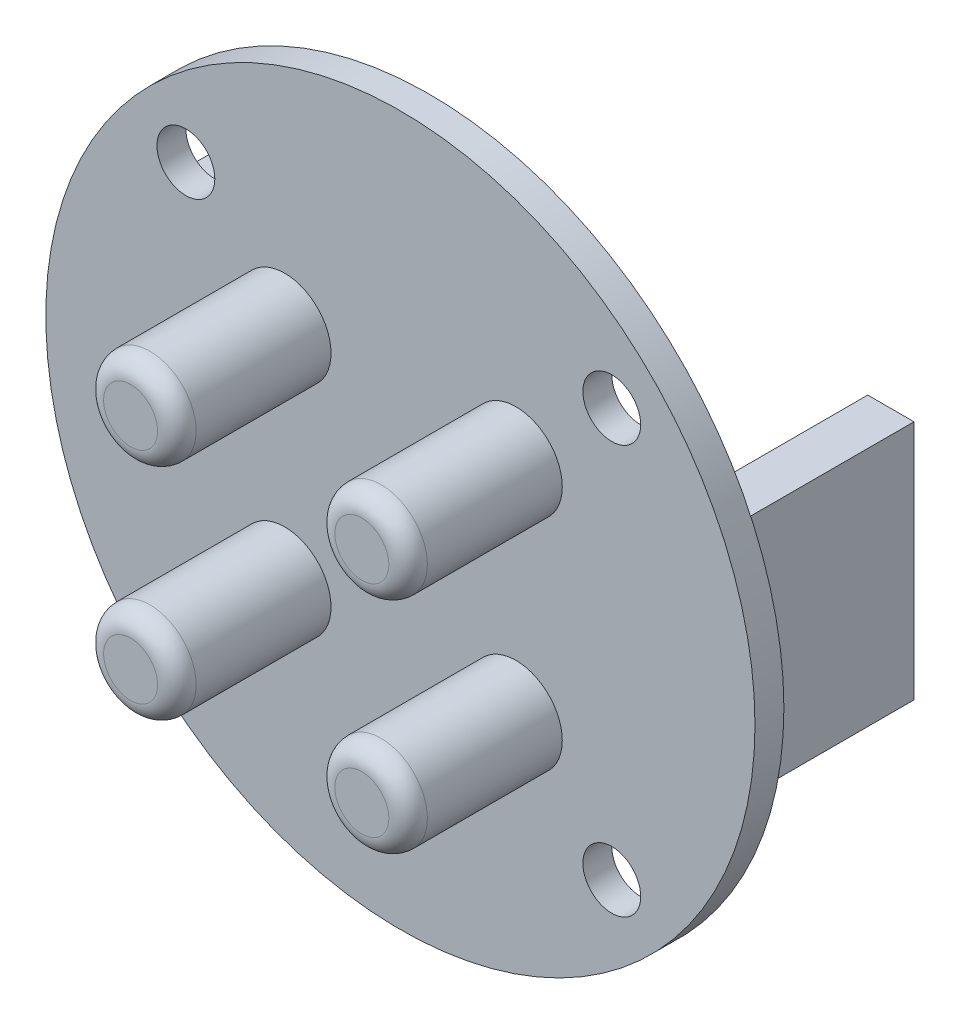
ISO-10303-21;
HEADER;
FILE_DESCRIPTION(('STEP AP214'),'2;1');
FILE_NAME('part.step','',(''),(''),'','','');
FILE_SCHEMA(('AUTOMOTIVE_DESIGN { 1 0 10303 214 1 1 1 1 }'));
ENDSEC;
DATA;
#1=APPLICATION_CONTEXT('core data for automotive mechanical design processes');
#2=APPLICATION_PROTOCOL_DEFINITION('international standard','automotive_design',2000,#1);
#3=PRODUCT_CONTEXT('',#1,'mechanical');
#4=PRODUCT('Part','Part','',(#3));
#5=PRODUCT_RELATED_PRODUCT_CATEGORY('part','',(#4));
#6=PRODUCT_DEFINITION_FORMATION('','',#4);
#7=PRODUCT_DEFINITION_CONTEXT('part definition',#1,'design');
#8=PRODUCT_DEFINITION('design','',#6,#7);
#9=PRODUCT_DEFINITION_SHAPE('','',#8);
#10=(LENGTH_UNIT() NAMED_UNIT(*) SI_UNIT(.MILLI.,.METRE.));
#11=(NAMED_UNIT(*) PLANE_ANGLE_UNIT() SI_UNIT($,.RADIAN.));
#12=(NAMED_UNIT(*) SI_UNIT($,.STERADIAN.) SOLID_ANGLE_UNIT());
#13=UNCERTAINTY_MEASURE_WITH_UNIT(LENGTH_MEASURE(1.E-05),#10,'distance_accuracy_value','');
#14=(GEOMETRIC_REPRESENTATION_CONTEXT(3) GLOBAL_UNCERTAINTY_ASSIGNED_CONTEXT((#13)) GLOBAL_UNIT_ASSIGNED_CONTEXT((#10,
#11,#12)) REPRESENTATION_CONTEXT('',''));
#15=CARTESIAN_POINT('',(0.,0.,0.));
#16=DIRECTION('',(0.,0.,1.));
#17=DIRECTION('',(1.,0.,0.));
#18=AXIS2_PLACEMENT_3D('',#15,#16,#17);
#19=CARTESIAN_POINT('',(0.,0.,0.));
#20=DIRECTION('',(0.,0.,1.));
#21=DIRECTION('',(1.,0.,0.));
#22=AXIS2_PLACEMENT_3D('',#19,#20,#21);
#23=PLANE('',#22);
#24=DIRECTION('',(0.,-1.,0.));
#25=VECTOR('',#24,1.);
#26=CARTESIAN_POINT('',(-12.75,6.25,0.));
#27=LINE('',#26,#25);
#28=CARTESIAN_POINT('',(-12.75,6.25,0.));
#29=VERTEX_POINT('',#28);
#30=CARTESIAN_POINT('',(-12.75,-6.25,0.));
#31=VERTEX_POINT('',#30);
#32=EDGE_CURVE('E119',#29,#31,#27,.T.);
#33=ORIENTED_EDGE('',*,*,#32,.F.);
#34=DIRECTION('',(1.,0.,0.));
#35=VECTOR('',#34,1.);
#36=CARTESIAN_POINT('',(-12.75,6.25,0.));
#37=LINE('',#36,#35);
#38=CARTESIAN_POINT('',(-15.15,6.25,0.));
#39=VERTEX_POINT('',#38);
#40=EDGE_CURVE('E132',#39,#29,#37,.T.);
#41=ORIENTED_EDGE('',*,*,#40,.F.);
#42=DIRECTION('',(0.,1.,0.));
#43=VECTOR('',#42,1.);
#44=CARTESIAN_POINT('',(-15.15,6.25,0.));
#45=LINE('',#44,#43);
#46=CARTESIAN_POINT('',(-15.15,-6.25,0.));
#47=VERTEX_POINT('',#46);
#48=EDGE_CURVE('E141',#47,#39,#45,.T.);
#49=ORIENTED_EDGE('',*,*,#48,.F.);
#50=DIRECTION('',(-1.,0.,0.));
#51=VECTOR('',#50,1.);
#52=CARTESIAN_POINT('',(-12.75,-6.25,0.));
#53=LINE('',#52,#51);
#54=EDGE_CURVE('E122',#31,#47,#53,.T.);
#55=ORIENTED_EDGE('',*,*,#54,.F.);
#56=EDGE_LOOP('',(#33,#41,#49,#55));
#57=FACE_BOUND('',#56,.T.);
#58=CARTESIAN_POINT('',(-11.1309461070474,10.5223503407509,0.));
#59=DIRECTION('',(0.,0.,-1.));
#60=DIRECTION('',(-1.,0.,0.));
#61=AXIS2_PLACEMENT_3D('',#58,#59,#60);
#62=CIRCLE('',#61,1.5);
#63=CARTESIAN_POINT('',(-12.6309461070474,10.5223503407509,0.));
#64=VERTEX_POINT('',#63);
#65=EDGE_CURVE('E161',#64,#64,#62,.T.);
#66=ORIENTED_EDGE('',*,*,#65,.F.);
#67=EDGE_LOOP('',(#66));
#68=FACE_BOUND('',#67,.T.);
#69=CARTESIAN_POINT('',(-11.1309461070474,-10.6776496592491,0.));
#70=DIRECTION('',(0.,0.,-1.));
#71=DIRECTION('',(-1.,0.,0.));
#72=AXIS2_PLACEMENT_3D('',#69,#70,#71);
#73=CIRCLE('',#72,1.5);
#74=CARTESIAN_POINT('',(-12.6309461070474,-10.6776496592491,0.));
#75=VERTEX_POINT('',#74);
#76=EDGE_CURVE('E158',#75,#75,#73,.T.);
#77=ORIENTED_EDGE('',*,*,#76,.F.);
#78=EDGE_LOOP('',(#77));
#79=FACE_BOUND('',#78,.T.);
#80=CARTESIAN_POINT('',(10.9690538929526,-10.6776496592491,0.));
#81=DIRECTION('',(0.,0.,-1.));
#82=DIRECTION('',(-1.,0.,0.));
#83=AXIS2_PLACEMENT_3D('',#80,#81,#82);
#84=CIRCLE('',#83,1.5);
#85=CARTESIAN_POINT('',(9.46905389295262,-10.6776496592491,0.));
#86=VERTEX_POINT('',#85);
#87=EDGE_CURVE('E162',#86,#86,#84,.T.);
#88=ORIENTED_EDGE('',*,*,#87,.F.);
#89=EDGE_LOOP('',(#88));
#90=FACE_BOUND('',#89,.T.);
#91=CARTESIAN_POINT('',(10.9690538929526,10.5223503407509,0.));
#92=DIRECTION('',(0.,0.,-1.));
#93=DIRECTION('',(-1.,0.,0.));
#94=AXIS2_PLACEMENT_3D('',#91,#92,#93);
#95=CIRCLE('',#94,1.5);
#96=CARTESIAN_POINT('',(9.46905389295262,10.5223503407509,0.));
#97=VERTEX_POINT('',#96);
#98=EDGE_CURVE('E157',#97,#97,#95,.T.);
#99=ORIENTED_EDGE('',*,*,#98,.F.);
#100=EDGE_LOOP('',(#99));
#101=FACE_BOUND('',#100,.T.);
#102=CARTESIAN_POINT('',(0.,0.,0.));
#103=DIRECTION('',(0.,0.,1.));
#104=DIRECTION('',(1.,0.,0.));
#105=AXIS2_PLACEMENT_3D('',#102,#103,#104);
#106=CIRCLE('',#105,18.4);
#107=CARTESIAN_POINT('',(18.4,0.,0.));
#108=VERTEX_POINT('',#107);
#109=EDGE_CURVE('E181',#108,#108,#106,.T.);
#110=ORIENTED_EDGE('',*,*,#109,.F.);
#111=EDGE_LOOP('',(#110));
#112=FACE_BOUND('',#111,.T.);
#113=DIRECTION('',(0.,-1.,0.));
#114=VECTOR('',#113,1.);
#115=CARTESIAN_POINT('',(15.15,6.25,0.));
#116=LINE('',#115,#114);
#117=CARTESIAN_POINT('',(15.15,6.25,0.));
#118=VERTEX_POINT('',#117);
#119=CARTESIAN_POINT('',(15.15,-6.25,0.));
#120=VERTEX_POINT('',#119);
#121=EDGE_CURVE('E118',#118,#120,#116,.T.);
#122=ORIENTED_EDGE('',*,*,#121,.F.);
#123=DIRECTION('',(1.,0.,0.));
#124=VECTOR('',#123,1.);
#125=CARTESIAN_POINT('',(15.15,6.25,0.));
#126=LINE('',#125,#124);
#127=CARTESIAN_POINT('',(12.75,6.25,0.));
#128=VERTEX_POINT('',#127);
#129=EDGE_CURVE('E115',#128,#118,#126,.T.);
#130=ORIENTED_EDGE('',*,*,#129,.F.);
#131=DIRECTION('',(0.,1.,0.));
#132=VECTOR('',#131,1.);
#133=CARTESIAN_POINT('',(12.75,6.25,0.));
#134=LINE('',#133,#132);
#135=CARTESIAN_POINT('',(12.75,-6.25,0.));
#136=VERTEX_POINT('',#135);
#137=EDGE_CURVE('E53',#136,#128,#134,.T.);
#138=ORIENTED_EDGE('',*,*,#137,.F.);
#139=DIRECTION('',(-1.,0.,0.));
#140=VECTOR('',#139,1.);
#141=CARTESIAN_POINT('',(15.15,-6.25,0.));
#142=LINE('',#141,#140);
#143=EDGE_CURVE('E48',#120,#136,#142,.T.);
#144=ORIENTED_EDGE('',*,*,#143,.F.);
#145=EDGE_LOOP('',(#122,#130,#138,#144));
#146=FACE_BOUND('',#145,.T.);
#147=ADVANCED_FACE('F33',(#57,#68,#79,#90,#101,#112,#146),#23,.F.);
#148=CARTESIAN_POINT('',(0.,0.,1.5));
#149=DIRECTION('',(0.,0.,-1.));
#150=DIRECTION('',(-1.,0.,0.));
#151=AXIS2_PLACEMENT_3D('',#148,#149,#150);
#152=CYLINDRICAL_SURFACE('',#151,18.4);
#153=CARTESIAN_POINT('',(0.,0.,1.5));
#154=DIRECTION('',(0.,0.,1.));
#155=DIRECTION('',(1.,0.,0.));
#156=AXIS2_PLACEMENT_3D('',#153,#154,#155);
#157=CIRCLE('',#156,18.4);
#158=CARTESIAN_POINT('',(18.4,0.,1.5));
#159=VERTEX_POINT('',#158);
#160=EDGE_CURVE('E182',#159,#159,#157,.T.);
#161=ORIENTED_EDGE('',*,*,#160,.F.);
#162=EDGE_LOOP('',(#161));
#163=FACE_BOUND('',#162,.T.);
#164=ORIENTED_EDGE('',*,*,#109,.T.);
#165=EDGE_LOOP('',(#164));
#166=FACE_BOUND('',#165,.T.);
#167=ADVANCED_FACE('F219',(#163,#166),#152,.T.);
#168=CARTESIAN_POINT('',(0.,0.,1.5));
#169=DIRECTION('',(0.,0.,1.));
#170=DIRECTION('',(1.,0.,0.));
#171=AXIS2_PLACEMENT_3D('',#168,#169,#170);
#172=PLANE('',#171);
#173=CARTESIAN_POINT('',(-6.,5.7,1.5));
#174=DIRECTION('',(0.,0.,1.));
#175=DIRECTION('',(1.,0.,0.));
#176=AXIS2_PLACEMENT_3D('',#173,#174,#175);
#177=CIRCLE('',#176,2.4);
#178=CARTESIAN_POINT('',(-3.6,5.7,1.5));
#179=VERTEX_POINT('',#178);
#180=EDGE_CURVE('E350',#179,#179,#177,.T.);
#181=ORIENTED_EDGE('',*,*,#180,.F.);
#182=EDGE_LOOP('',(#181));
#183=FACE_BOUND('',#182,.T.);
#184=CARTESIAN_POINT('',(-6.,-5.7,1.5));
#185=DIRECTION('',(0.,0.,1.));
#186=DIRECTION('',(1.,0.,0.));
#187=AXIS2_PLACEMENT_3D('',#184,#185,#186);
#188=CIRCLE('',#187,2.4);
#189=CARTESIAN_POINT('',(-3.6,-5.7,1.5));
#190=VERTEX_POINT('',#189);
#191=EDGE_CURVE('E347',#190,#190,#188,.T.);
#192=ORIENTED_EDGE('',*,*,#191,.F.);
#193=EDGE_LOOP('',(#192));
#194=FACE_BOUND('',#193,.T.);
#195=CARTESIAN_POINT('',(6.,-5.7,1.5));
#196=DIRECTION('',(0.,0.,1.));
#197=DIRECTION('',(1.,0.,0.));
#198=AXIS2_PLACEMENT_3D('',#195,#196,#197);
#199=CIRCLE('',#198,2.4);
#200=CARTESIAN_POINT('',(8.4,-5.7,1.5));
#201=VERTEX_POINT('',#200);
#202=EDGE_CURVE('E344',#201,#201,#199,.T.);
#203=ORIENTED_EDGE('',*,*,#202,.F.);
#204=EDGE_LOOP('',(#203));
#205=FACE_BOUND('',#204,.T.);
#206=CARTESIAN_POINT('',(6.,5.7,1.5));
#207=DIRECTION('',(0.,0.,1.));
#208=DIRECTION('',(1.,0.,0.));
#209=AXIS2_PLACEMENT_3D('',#206,#207,#208);
#210=CIRCLE('',#209,2.4);
#211=CARTESIAN_POINT('',(8.4,5.7,1.5));
#212=VERTEX_POINT('',#211);
#213=EDGE_CURVE('E330',#212,#212,#210,.T.);
#214=ORIENTED_EDGE('',*,*,#213,.F.);
#215=EDGE_LOOP('',(#214));
#216=FACE_BOUND('',#215,.T.);
#217=CARTESIAN_POINT('',(-11.1309461070474,10.5223503407509,1.5));
#218=DIRECTION('',(0.,0.,1.));
#219=DIRECTION('',(1.,0.,0.));
#220=AXIS2_PLACEMENT_3D('',#217,#218,#219);
#221=CIRCLE('',#220,1.5);
#222=CARTESIAN_POINT('',(-9.63094610704739,10.5223503407509,1.5));
#223=VERTEX_POINT('',#222);
#224=EDGE_CURVE('E178',#223,#223,#221,.T.);
#225=ORIENTED_EDGE('',*,*,#224,.F.);
#226=EDGE_LOOP('',(#225));
#227=FACE_BOUND('',#226,.T.);
#228=CARTESIAN_POINT('',(-11.1309461070474,-10.6776496592491,1.5));
#229=DIRECTION('',(0.,0.,1.));
#230=DIRECTION('',(1.,0.,0.));
#231=AXIS2_PLACEMENT_3D('',#228,#229,#230);
#232=CIRCLE('',#231,1.5);
#233=CARTESIAN_POINT('',(-9.63094610704739,-10.6776496592491,1.5));
#234=VERTEX_POINT('',#233);
#235=EDGE_CURVE('E175',#234,#234,#232,.T.);
#236=ORIENTED_EDGE('',*,*,#235,.F.);
#237=EDGE_LOOP('',(#236));
#238=FACE_BOUND('',#237,.T.);
#239=CARTESIAN_POINT('',(10.9690538929526,-10.6776496592491,1.5));
#240=DIRECTION('',(0.,0.,1.));
#241=DIRECTION('',(1.,0.,0.));
#242=AXIS2_PLACEMENT_3D('',#239,#240,#241);
#243=CIRCLE('',#242,1.5);
#244=CARTESIAN_POINT('',(12.4690538929526,-10.6776496592491,1.5));
#245=VERTEX_POINT('',#244);
#246=EDGE_CURVE('E172',#245,#245,#243,.T.);
#247=ORIENTED_EDGE('',*,*,#246,.F.);
#248=EDGE_LOOP('',(#247));
#249=FACE_BOUND('',#248,.T.);
#250=CARTESIAN_POINT('',(10.9690538929526,10.5223503407509,1.5));
#251=DIRECTION('',(0.,0.,1.));
#252=DIRECTION('',(1.,0.,0.));
#253=AXIS2_PLACEMENT_3D('',#250,#251,#252);
#254=CIRCLE('',#253,1.5);
#255=CARTESIAN_POINT('',(12.4690538929526,10.5223503407509,1.5));
#256=VERTEX_POINT('',#255);
#257=EDGE_CURVE('E169',#256,#256,#254,.T.);
#258=ORIENTED_EDGE('',*,*,#257,.F.);
#259=EDGE_LOOP('',(#258));
#260=FACE_BOUND('',#259,.T.);
#261=ORIENTED_EDGE('',*,*,#160,.T.);
#262=EDGE_LOOP('',(#261));
#263=FACE_BOUND('',#262,.T.);
#264=ADVANCED_FACE('F225',(#183,#194,#205,#216,#227,#238,#249,#260,#263),#172,.T.);
#265=CARTESIAN_POINT('',(10.9690538929526,10.5223503407509,10.));
#266=DIRECTION('',(0.,0.,-1.));
#267=DIRECTION('',(-1.,0.,0.));
#268=AXIS2_PLACEMENT_3D('',#265,#266,#267);
#269=CYLINDRICAL_SURFACE('',#268,1.5);
#270=ORIENTED_EDGE('',*,*,#257,.T.);
#271=EDGE_LOOP('',(#270));
#272=FACE_BOUND('',#271,.T.);
#273=ORIENTED_EDGE('',*,*,#98,.T.);
#274=EDGE_LOOP('',(#273));
#275=FACE_BOUND('',#274,.T.);
#276=ADVANCED_FACE('F310',(#272,#275),#269,.F.);
#277=CARTESIAN_POINT('',(10.9690538929526,-10.6776496592491,10.));
#278=DIRECTION('',(0.,0.,-1.));
#279=DIRECTION('',(-1.,0.,0.));
#280=AXIS2_PLACEMENT_3D('',#277,#278,#279);
#281=CYLINDRICAL_SURFACE('',#280,1.5);
#282=ORIENTED_EDGE('',*,*,#246,.T.);
#283=EDGE_LOOP('',(#282));
#284=FACE_BOUND('',#283,.T.);
#285=ORIENTED_EDGE('',*,*,#87,.T.);
#286=EDGE_LOOP('',(#285));
#287=FACE_BOUND('',#286,.T.);
#288=ADVANCED_FACE('F306',(#284,#287),#281,.F.);
#289=CARTESIAN_POINT('',(-11.1309461070474,-10.6776496592491,10.));
#290=DIRECTION('',(0.,0.,-1.));
#291=DIRECTION('',(-1.,0.,0.));
#292=AXIS2_PLACEMENT_3D('',#289,#290,#291);
#293=CYLINDRICAL_SURFACE('',#292,1.5);
#294=ORIENTED_EDGE('',*,*,#235,.T.);
#295=EDGE_LOOP('',(#294));
#296=FACE_BOUND('',#295,.T.);
#297=ORIENTED_EDGE('',*,*,#76,.T.);
#298=EDGE_LOOP('',(#297));
#299=FACE_BOUND('',#298,.T.);
#300=ADVANCED_FACE('F303',(#296,#299),#293,.F.);
#301=CARTESIAN_POINT('',(-11.1309461070474,10.5223503407509,10.));
#302=DIRECTION('',(0.,0.,-1.));
#303=DIRECTION('',(-1.,0.,0.));
#304=AXIS2_PLACEMENT_3D('',#301,#302,#303);
#305=CYLINDRICAL_SURFACE('',#304,1.5);
#306=ORIENTED_EDGE('',*,*,#224,.T.);
#307=EDGE_LOOP('',(#306));
#308=FACE_BOUND('',#307,.T.);
#309=ORIENTED_EDGE('',*,*,#65,.T.);
#310=EDGE_LOOP('',(#309));
#311=FACE_BOUND('',#310,.T.);
#312=ADVANCED_FACE('F301',(#308,#311),#305,.F.);
#313=CARTESIAN_POINT('',(-12.75,6.25,-10.));
#314=DIRECTION('',(-1.,0.,0.));
#315=DIRECTION('',(0.,0.,1.));
#316=AXIS2_PLACEMENT_3D('',#313,#314,#315);
#317=PLANE('',#316);
#318=ORIENTED_EDGE('',*,*,#32,.T.);
#319=DIRECTION('',(0.,0.,1.));
#320=VECTOR('',#319,1.);
#321=CARTESIAN_POINT('',(-12.75,-6.25,-10.));
#322=LINE('',#321,#320);
#323=CARTESIAN_POINT('',(-12.75,-6.25,-10.));
#324=VERTEX_POINT('',#323);
#325=EDGE_CURVE('E154',#324,#31,#322,.T.);
#326=ORIENTED_EDGE('',*,*,#325,.F.);
#327=DIRECTION('',(0.,-1.,0.));
#328=VECTOR('',#327,1.);
#329=CARTESIAN_POINT('',(-12.75,6.25,-10.));
#330=LINE('',#329,#328);
#331=CARTESIAN_POINT('',(-12.75,6.25,-10.));
#332=VERTEX_POINT('',#331);
#333=EDGE_CURVE('E128',#332,#324,#330,.T.);
#334=ORIENTED_EDGE('',*,*,#333,.F.);
#335=DIRECTION('',(0.,0.,1.));
#336=VECTOR('',#335,1.);
#337=CARTESIAN_POINT('',(-12.75,6.25,-10.));
#338=LINE('',#337,#336);
#339=EDGE_CURVE('E137',#332,#29,#338,.T.);
#340=ORIENTED_EDGE('',*,*,#339,.T.);
#341=EDGE_LOOP('',(#318,#326,#334,#340));
#342=FACE_BOUND('',#341,.T.);
#343=ADVANCED_FACE('F297',(#342),#317,.F.);
#344=CARTESIAN_POINT('',(-12.75,-6.25,-10.));
#345=DIRECTION('',(0.,1.,0.));
#346=DIRECTION('',(0.,0.,1.));
#347=AXIS2_PLACEMENT_3D('',#344,#345,#346);
#348=PLANE('',#347);
#349=ORIENTED_EDGE('',*,*,#54,.T.);
#350=DIRECTION('',(0.,0.,1.));
#351=VECTOR('',#350,1.);
#352=CARTESIAN_POINT('',(-15.15,-6.25,-10.));
#353=LINE('',#352,#351);
#354=CARTESIAN_POINT('',(-15.15,-6.25,-10.));
#355=VERTEX_POINT('',#354);
#356=EDGE_CURVE('E151',#355,#47,#353,.T.);
#357=ORIENTED_EDGE('',*,*,#356,.F.);
#358=DIRECTION('',(-1.,0.,0.));
#359=VECTOR('',#358,1.);
#360=CARTESIAN_POINT('',(-12.75,-6.25,-10.));
#361=LINE('',#360,#359);
#362=EDGE_CURVE('E131',#324,#355,#361,.T.);
#363=ORIENTED_EDGE('',*,*,#362,.F.);
#364=ORIENTED_EDGE('',*,*,#325,.T.);
#365=EDGE_LOOP('',(#349,#357,#363,#364));
#366=FACE_BOUND('',#365,.T.);
#367=ADVANCED_FACE('F293',(#366),#348,.F.);
#368=CARTESIAN_POINT('',(-15.15,6.25,-10.));
#369=DIRECTION('',(1.,0.,0.));
#370=DIRECTION('',(0.,1.,0.));
#371=AXIS2_PLACEMENT_3D('',#368,#369,#370);
#372=PLANE('',#371);
#373=ORIENTED_EDGE('',*,*,#48,.T.);
#374=DIRECTION('',(0.,0.,1.));
#375=VECTOR('',#374,1.);
#376=CARTESIAN_POINT('',(-15.15,6.25,-10.));
#377=LINE('',#376,#375);
#378=CARTESIAN_POINT('',(-15.15,6.25,-10.));
#379=VERTEX_POINT('',#378);
#380=EDGE_CURVE('E148',#379,#39,#377,.T.);
#381=ORIENTED_EDGE('',*,*,#380,.F.);
#382=DIRECTION('',(0.,1.,0.));
#383=VECTOR('',#382,1.);
#384=CARTESIAN_POINT('',(-15.15,6.25,-10.));
#385=LINE('',#384,#383);
#386=EDGE_CURVE('E134',#355,#379,#385,.T.);
#387=ORIENTED_EDGE('',*,*,#386,.F.);
#388=ORIENTED_EDGE('',*,*,#356,.T.);
#389=EDGE_LOOP('',(#373,#381,#387,#388));
#390=FACE_BOUND('',#389,.T.);
#391=ADVANCED_FACE('F289',(#390),#372,.F.);
#392=CARTESIAN_POINT('',(-12.75,6.25,-10.));
#393=DIRECTION('',(0.,-1.,0.));
#394=DIRECTION('',(0.,0.,-1.));
#395=AXIS2_PLACEMENT_3D('',#392,#393,#394);
#396=PLANE('',#395);
#397=ORIENTED_EDGE('',*,*,#40,.T.);
#398=ORIENTED_EDGE('',*,*,#339,.F.);
#399=DIRECTION('',(1.,0.,0.));
#400=VECTOR('',#399,1.);
#401=CARTESIAN_POINT('',(-12.75,6.25,-10.));
#402=LINE('',#401,#400);
#403=EDGE_CURVE('E136',#379,#332,#402,.T.);
#404=ORIENTED_EDGE('',*,*,#403,.F.);
#405=ORIENTED_EDGE('',*,*,#380,.T.);
#406=EDGE_LOOP('',(#397,#398,#404,#405));
#407=FACE_BOUND('',#406,.T.);
#408=ADVANCED_FACE('F285',(#407),#396,.F.);
#409=CARTESIAN_POINT('',(0.,0.,-10.));
#410=DIRECTION('',(0.,0.,-1.));
#411=DIRECTION('',(-1.,0.,0.));
#412=AXIS2_PLACEMENT_3D('',#409,#410,#411);
#413=PLANE('',#412);
#414=ORIENTED_EDGE('',*,*,#333,.T.);
#415=ORIENTED_EDGE('',*,*,#362,.T.);
#416=ORIENTED_EDGE('',*,*,#386,.T.);
#417=ORIENTED_EDGE('',*,*,#403,.T.);
#418=EDGE_LOOP('',(#414,#415,#416,#417));
#419=FACE_BOUND('',#418,.T.);
#420=ADVANCED_FACE('F282',(#419),#413,.T.);
#421=CARTESIAN_POINT('',(15.15,6.25,-10.));
#422=DIRECTION('',(-1.,0.,0.));
#423=DIRECTION('',(0.,-1.,0.));
#424=AXIS2_PLACEMENT_3D('',#421,#422,#423);
#425=PLANE('',#424);
#426=ORIENTED_EDGE('',*,*,#121,.T.);
#427=DIRECTION('',(0.,0.,1.));
#428=VECTOR('',#427,1.);
#429=CARTESIAN_POINT('',(15.15,-6.25,-10.));
#430=LINE('',#429,#428);
#431=CARTESIAN_POINT('',(15.15,-6.25,-10.));
#432=VERTEX_POINT('',#431);
#433=EDGE_CURVE('E99',#432,#120,#430,.T.);
#434=ORIENTED_EDGE('',*,*,#433,.F.);
#435=DIRECTION('',(0.,-1.,0.));
#436=VECTOR('',#435,1.);
#437=CARTESIAN_POINT('',(15.15,6.25,-10.));
#438=LINE('',#437,#436);
#439=CARTESIAN_POINT('',(15.15,6.25,-10.));
#440=VERTEX_POINT('',#439);
#441=EDGE_CURVE('E106',#440,#432,#438,.T.);
#442=ORIENTED_EDGE('',*,*,#441,.F.);
#443=DIRECTION('',(0.,0.,1.));
#444=VECTOR('',#443,1.);
#445=CARTESIAN_POINT('',(15.15,6.25,-10.));
#446=LINE('',#445,#444);
#447=EDGE_CURVE('E333',#440,#118,#446,.T.);
#448=ORIENTED_EDGE('',*,*,#447,.T.);
#449=EDGE_LOOP('',(#426,#434,#442,#448));
#450=FACE_BOUND('',#449,.T.);
#451=ADVANCED_FACE('F117',(#450),#425,.F.);
#452=CARTESIAN_POINT('',(15.15,-6.25,-10.));
#453=DIRECTION('',(0.,1.,0.));
#454=DIRECTION('',(-1.,0.,0.));
#455=AXIS2_PLACEMENT_3D('',#452,#453,#454);
#456=PLANE('',#455);
#457=ORIENTED_EDGE('',*,*,#143,.T.);
#458=DIRECTION('',(0.,0.,1.));
#459=VECTOR('',#458,1.);
#460=CARTESIAN_POINT('',(12.75,-6.25,-10.));
#461=LINE('',#460,#459);
#462=CARTESIAN_POINT('',(12.75,-6.25,-10.));
#463=VERTEX_POINT('',#462);
#464=EDGE_CURVE('E102',#463,#136,#461,.T.);
#465=ORIENTED_EDGE('',*,*,#464,.F.);
#466=DIRECTION('',(-1.,0.,0.));
#467=VECTOR('',#466,1.);
#468=CARTESIAN_POINT('',(15.15,-6.25,-10.));
#469=LINE('',#468,#467);
#470=EDGE_CURVE('E95',#432,#463,#469,.T.);
#471=ORIENTED_EDGE('',*,*,#470,.F.);
#472=ORIENTED_EDGE('',*,*,#433,.T.);
#473=EDGE_LOOP('',(#457,#465,#471,#472));
#474=FACE_BOUND('',#473,.T.);
#475=ADVANCED_FACE('F97',(#474),#456,.F.);
#476=CARTESIAN_POINT('',(12.75,6.25,-10.));
#477=DIRECTION('',(1.,0.,0.));
#478=DIRECTION('',(0.,1.,0.));
#479=AXIS2_PLACEMENT_3D('',#476,#477,#478);
#480=PLANE('',#479);
#481=ORIENTED_EDGE('',*,*,#137,.T.);
#482=DIRECTION('',(0.,0.,1.));
#483=VECTOR('',#482,1.);
#484=CARTESIAN_POINT('',(12.75,6.25,-10.));
#485=LINE('',#484,#483);
#486=CARTESIAN_POINT('',(12.75,6.25,-10.));
#487=VERTEX_POINT('',#486);
#488=EDGE_CURVE('E124',#487,#128,#485,.T.);
#489=ORIENTED_EDGE('',*,*,#488,.F.);
#490=DIRECTION('',(0.,1.,0.));
#491=VECTOR('',#490,1.);
#492=CARTESIAN_POINT('',(12.75,6.25,-10.));
#493=LINE('',#492,#491);
#494=EDGE_CURVE('E105',#463,#487,#493,.T.);
#495=ORIENTED_EDGE('',*,*,#494,.F.);
#496=ORIENTED_EDGE('',*,*,#464,.T.);
#497=EDGE_LOOP('',(#481,#489,#495,#496));
#498=FACE_BOUND('',#497,.T.);
#499=ADVANCED_FACE('F273',(#498),#480,.F.);
#500=CARTESIAN_POINT('',(15.15,6.25,-10.));
#501=DIRECTION('',(0.,-1.,0.));
#502=DIRECTION('',(1.,0.,0.));
#503=AXIS2_PLACEMENT_3D('',#500,#501,#502);
#504=PLANE('',#503);
#505=ORIENTED_EDGE('',*,*,#129,.T.);
#506=ORIENTED_EDGE('',*,*,#447,.F.);
#507=DIRECTION('',(1.,0.,0.));
#508=VECTOR('',#507,1.);
#509=CARTESIAN_POINT('',(15.15,6.25,-10.));
#510=LINE('',#509,#508);
#511=EDGE_CURVE('E111',#487,#440,#510,.T.);
#512=ORIENTED_EDGE('',*,*,#511,.F.);
#513=ORIENTED_EDGE('',*,*,#488,.T.);
#514=EDGE_LOOP('',(#505,#506,#512,#513));
#515=FACE_BOUND('',#514,.T.);
#516=ADVANCED_FACE('F270',(#515),#504,.F.);
#517=CARTESIAN_POINT('',(0.,0.,-10.));
#518=DIRECTION('',(0.,0.,-1.));
#519=DIRECTION('',(-1.,0.,0.));
#520=AXIS2_PLACEMENT_3D('',#517,#518,#519);
#521=PLANE('',#520);
#522=ORIENTED_EDGE('',*,*,#441,.T.);
#523=ORIENTED_EDGE('',*,*,#470,.T.);
#524=ORIENTED_EDGE('',*,*,#494,.T.);
#525=ORIENTED_EDGE('',*,*,#511,.T.);
#526=EDGE_LOOP('',(#522,#523,#524,#525));
#527=FACE_BOUND('',#526,.T.);
#528=ADVANCED_FACE('F109',(#527),#521,.T.);
#529=CARTESIAN_POINT('',(6.,5.7,9.5));
#530=DIRECTION('',(0.,0.,-1.));
#531=DIRECTION('',(-1.,0.,0.));
#532=AXIS2_PLACEMENT_3D('',#529,#530,#531);
#533=CYLINDRICAL_SURFACE('',#532,2.4);
#534=CARTESIAN_POINT('',(6.,5.7,8.5));
#535=DIRECTION('',(0.,0.,1.));
#536=DIRECTION('',(1.,0.,0.));
#537=AXIS2_PLACEMENT_3D('',#534,#535,#536);
#538=CIRCLE('',#537,2.4);
#539=CARTESIAN_POINT('',(8.4,5.7,8.5));
#540=VERTEX_POINT('',#539);
#541=EDGE_CURVE('E190',#540,#540,#538,.F.);
#542=ORIENTED_EDGE('',*,*,#541,.T.);
#543=EDGE_LOOP('',(#542));
#544=FACE_BOUND('',#543,.T.);
#545=ORIENTED_EDGE('',*,*,#213,.T.);
#546=EDGE_LOOP('',(#545));
#547=FACE_BOUND('',#546,.T.);
#548=ADVANCED_FACE('F263',(#544,#547),#533,.T.);
#549=CARTESIAN_POINT('',(6.,5.7,9.5));
#550=DIRECTION('',(0.,0.,1.));
#551=DIRECTION('',(1.,0.,0.));
#552=AXIS2_PLACEMENT_3D('',#549,#550,#551);
#553=PLANE('',#552);
#554=CARTESIAN_POINT('',(6.,5.7,9.5));
#555=DIRECTION('',(0.,0.,1.));
#556=DIRECTION('',(1.,0.,0.));
#557=AXIS2_PLACEMENT_3D('',#554,#555,#556);
#558=CIRCLE('',#557,1.4);
#559=CARTESIAN_POINT('',(7.4,5.7,9.5));
#560=VERTEX_POINT('',#559);
#561=EDGE_CURVE('E185',#560,#560,#558,.T.);
#562=ORIENTED_EDGE('',*,*,#561,.T.);
#563=EDGE_LOOP('',(#562));
#564=FACE_BOUND('',#563,.T.);
#565=ADVANCED_FACE('F256',(#564),#553,.T.);
#566=CARTESIAN_POINT('',(6.,-5.7,9.5));
#567=DIRECTION('',(0.,0.,-1.));
#568=DIRECTION('',(-1.,0.,0.));
#569=AXIS2_PLACEMENT_3D('',#566,#567,#568);
#570=CYLINDRICAL_SURFACE('',#569,2.4);
#571=CARTESIAN_POINT('',(6.,-5.7,8.5));
#572=DIRECTION('',(0.,0.,1.));
#573=DIRECTION('',(1.,0.,0.));
#574=AXIS2_PLACEMENT_3D('',#571,#572,#573);
#575=CIRCLE('',#574,2.4);
#576=CARTESIAN_POINT('',(8.4,-5.7,8.5));
#577=VERTEX_POINT('',#576);
#578=EDGE_CURVE('E196',#577,#577,#575,.F.);
#579=ORIENTED_EDGE('',*,*,#578,.T.);
#580=EDGE_LOOP('',(#579));
#581=FACE_BOUND('',#580,.T.);
#582=ORIENTED_EDGE('',*,*,#202,.T.);
#583=EDGE_LOOP('',(#582));
#584=FACE_BOUND('',#583,.T.);
#585=ADVANCED_FACE('F247',(#581,#584),#570,.T.);
#586=CARTESIAN_POINT('',(6.,-5.7,9.5));
#587=DIRECTION('',(0.,0.,1.));
#588=DIRECTION('',(1.,0.,0.));
#589=AXIS2_PLACEMENT_3D('',#586,#587,#588);
#590=PLANE('',#589);
#591=CARTESIAN_POINT('',(6.,-5.7,9.5));
#592=DIRECTION('',(0.,0.,1.));
#593=DIRECTION('',(1.,0.,0.));
#594=AXIS2_PLACEMENT_3D('',#591,#592,#593);
#595=CIRCLE('',#594,1.4);
#596=CARTESIAN_POINT('',(7.4,-5.7,9.5));
#597=VERTEX_POINT('',#596);
#598=EDGE_CURVE('E193',#597,#597,#595,.T.);
#599=ORIENTED_EDGE('',*,*,#598,.T.);
#600=EDGE_LOOP('',(#599));
#601=FACE_BOUND('',#600,.T.);
#602=ADVANCED_FACE('F244',(#601),#590,.T.);
#603=CARTESIAN_POINT('',(-6.,-5.7,9.5));
#604=DIRECTION('',(0.,0.,-1.));
#605=DIRECTION('',(-1.,0.,0.));
#606=AXIS2_PLACEMENT_3D('',#603,#604,#605);
#607=CYLINDRICAL_SURFACE('',#606,2.4);
#608=CARTESIAN_POINT('',(-6.,-5.7,8.5));
#609=DIRECTION('',(0.,0.,1.));
#610=DIRECTION('',(1.,0.,0.));
#611=AXIS2_PLACEMENT_3D('',#608,#609,#610);
#612=CIRCLE('',#611,2.4);
#613=CARTESIAN_POINT('',(-3.6,-5.7,8.5));
#614=VERTEX_POINT('',#613);
#615=EDGE_CURVE('E202',#614,#614,#612,.F.);
#616=ORIENTED_EDGE('',*,*,#615,.T.);
#617=EDGE_LOOP('',(#616));
#618=FACE_BOUND('',#617,.T.);
#619=ORIENTED_EDGE('',*,*,#191,.T.);
#620=EDGE_LOOP('',(#619));
#621=FACE_BOUND('',#620,.T.);
#622=ADVANCED_FACE('F246',(#618,#621),#607,.T.);
#623=CARTESIAN_POINT('',(-6.,-5.7,9.5));
#624=DIRECTION('',(0.,0.,1.));
#625=DIRECTION('',(1.,0.,0.));
#626=AXIS2_PLACEMENT_3D('',#623,#624,#625);
#627=PLANE('',#626);
#628=CARTESIAN_POINT('',(-6.,-5.7,9.5));
#629=DIRECTION('',(0.,0.,1.));
#630=DIRECTION('',(1.,0.,0.));
#631=AXIS2_PLACEMENT_3D('',#628,#629,#630);
#632=CIRCLE('',#631,1.4);
#633=CARTESIAN_POINT('',(-4.6,-5.7,9.5));
#634=VERTEX_POINT('',#633);
#635=EDGE_CURVE('E199',#634,#634,#632,.T.);
#636=ORIENTED_EDGE('',*,*,#635,.T.);
#637=EDGE_LOOP('',(#636));
#638=FACE_BOUND('',#637,.T.);
#639=ADVANCED_FACE('F253',(#638),#627,.T.);
#640=CARTESIAN_POINT('',(-6.,5.7,9.5));
#641=DIRECTION('',(0.,0.,-1.));
#642=DIRECTION('',(-1.,0.,0.));
#643=AXIS2_PLACEMENT_3D('',#640,#641,#642);
#644=CYLINDRICAL_SURFACE('',#643,2.4);
#645=CARTESIAN_POINT('',(-6.,5.7,8.5));
#646=DIRECTION('',(0.,0.,1.));
#647=DIRECTION('',(1.,0.,0.));
#648=AXIS2_PLACEMENT_3D('',#645,#646,#647);
#649=CIRCLE('',#648,2.4);
#650=CARTESIAN_POINT('',(-3.6,5.7,8.5));
#651=VERTEX_POINT('',#650);
#652=EDGE_CURVE('E11',#651,#651,#649,.F.);
#653=ORIENTED_EDGE('',*,*,#652,.T.);
#654=EDGE_LOOP('',(#653));
#655=FACE_BOUND('',#654,.T.);
#656=ORIENTED_EDGE('',*,*,#180,.T.);
#657=EDGE_LOOP('',(#656));
#658=FACE_BOUND('',#657,.T.);
#659=ADVANCED_FACE('F354',(#655,#658),#644,.T.);
#660=CARTESIAN_POINT('',(-6.,5.7,9.5));
#661=DIRECTION('',(0.,0.,1.));
#662=DIRECTION('',(1.,0.,0.));
#663=AXIS2_PLACEMENT_3D('',#660,#661,#662);
#664=PLANE('',#663);
#665=CARTESIAN_POINT('',(-6.,5.7,9.5));
#666=DIRECTION('',(0.,0.,1.));
#667=DIRECTION('',(1.,0.,0.));
#668=AXIS2_PLACEMENT_3D('',#665,#666,#667);
#669=CIRCLE('',#668,1.4);
#670=CARTESIAN_POINT('',(-4.6,5.7,9.5));
#671=VERTEX_POINT('',#670);
#672=EDGE_CURVE('E41',#671,#671,#669,.T.);
#673=ORIENTED_EDGE('',*,*,#672,.T.);
#674=EDGE_LOOP('',(#673));
#675=FACE_BOUND('',#674,.T.);
#676=ADVANCED_FACE('F207',(#675),#664,.T.);
#677=CARTESIAN_POINT('',(6.,5.7,8.5));
#678=DIRECTION('',(0.,0.,1.));
#679=DIRECTION('',(1.,0.,0.));
#680=AXIS2_PLACEMENT_3D('',#677,#678,#679);
#681=TOROIDAL_SURFACE('',#680,1.4,1.);
#682=ORIENTED_EDGE('',*,*,#541,.F.);
#683=EDGE_LOOP('',(#682));
#684=FACE_BOUND('',#683,.T.);
#685=ORIENTED_EDGE('',*,*,#561,.F.);
#686=EDGE_LOOP('',(#685));
#687=FACE_BOUND('',#686,.T.);
#688=ADVANCED_FACE('F232',(#684,#687),#681,.T.);
#689=CARTESIAN_POINT('',(6.,-5.7,8.5));
#690=DIRECTION('',(0.,0.,1.));
#691=DIRECTION('',(1.,0.,0.));
#692=AXIS2_PLACEMENT_3D('',#689,#690,#691);
#693=TOROIDAL_SURFACE('',#692,1.4,1.);
#694=ORIENTED_EDGE('',*,*,#578,.F.);
#695=EDGE_LOOP('',(#694));
#696=FACE_BOUND('',#695,.T.);
#697=ORIENTED_EDGE('',*,*,#598,.F.);
#698=EDGE_LOOP('',(#697));
#699=FACE_BOUND('',#698,.T.);
#700=ADVANCED_FACE('F215',(#696,#699),#693,.T.);
#701=CARTESIAN_POINT('',(-6.,-5.7,8.5));
#702=DIRECTION('',(0.,0.,1.));
#703=DIRECTION('',(1.,0.,0.));
#704=AXIS2_PLACEMENT_3D('',#701,#702,#703);
#705=TOROIDAL_SURFACE('',#704,1.4,1.);
#706=ORIENTED_EDGE('',*,*,#615,.F.);
#707=EDGE_LOOP('',(#706));
#708=FACE_BOUND('',#707,.T.);
#709=ORIENTED_EDGE('',*,*,#635,.F.);
#710=EDGE_LOOP('',(#709));
#711=FACE_BOUND('',#710,.T.);
#712=ADVANCED_FACE('F210',(#708,#711),#705,.T.);
#713=CARTESIAN_POINT('',(-6.,5.7,8.5));
#714=DIRECTION('',(0.,0.,1.));
#715=DIRECTION('',(1.,0.,0.));
#716=AXIS2_PLACEMENT_3D('',#713,#714,#715);
#717=TOROIDAL_SURFACE('',#716,1.4,1.);
#718=ORIENTED_EDGE('',*,*,#652,.F.);
#719=EDGE_LOOP('',(#718));
#720=FACE_BOUND('',#719,.T.);
#721=ORIENTED_EDGE('',*,*,#672,.F.);
#722=EDGE_LOOP('',(#721));
#723=FACE_BOUND('',#722,.T.);
#724=ADVANCED_FACE('F35',(#720,#723),#717,.T.);
#725=CLOSED_SHELL('',(#147,#167,#264,#276,#288,#300,#312,#343,#367,#391,#408,#420,#451,#475,
#499,#516,#528,#548,#565,#585,#602,#622,#639,#659,#676,#688,#700,#712,#724));
#726=MANIFOLD_SOLID_BREP('B2',#725);
#727=ADVANCED_BREP_SHAPE_REPRESENTATION('',(#18,#726),#14);
#728=SHAPE_DEFINITION_REPRESENTATION(#9,#727);
ENDSEC;
END-ISO-10303-21;
